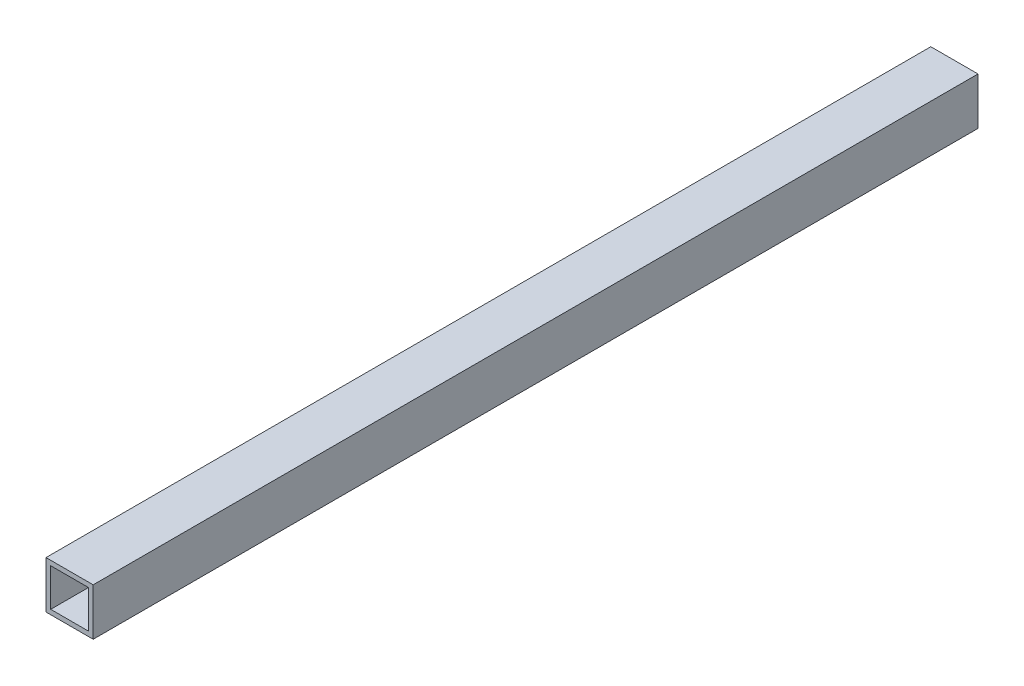
ISO-10303-21;
HEADER;
FILE_DESCRIPTION(('STEP AP214'),'2;1');
FILE_NAME('part.step','',(''),(''),'','','');
FILE_SCHEMA(('AUTOMOTIVE_DESIGN { 1 0 10303 214 1 1 1 1 }'));
ENDSEC;
DATA;
#1=APPLICATION_CONTEXT('core data for automotive mechanical design processes');
#2=APPLICATION_PROTOCOL_DEFINITION('international standard','automotive_design',2000,#1);
#3=PRODUCT_CONTEXT('',#1,'mechanical');
#4=PRODUCT('Part','Part','',(#3));
#5=PRODUCT_RELATED_PRODUCT_CATEGORY('part','',(#4));
#6=PRODUCT_DEFINITION_FORMATION('','',#4);
#7=PRODUCT_DEFINITION_CONTEXT('part definition',#1,'design');
#8=PRODUCT_DEFINITION('design','',#6,#7);
#9=PRODUCT_DEFINITION_SHAPE('','',#8);
#10=(LENGTH_UNIT() NAMED_UNIT(*) SI_UNIT(.MILLI.,.METRE.));
#11=(NAMED_UNIT(*) PLANE_ANGLE_UNIT() SI_UNIT($,.RADIAN.));
#12=(NAMED_UNIT(*) SI_UNIT($,.STERADIAN.) SOLID_ANGLE_UNIT());
#13=UNCERTAINTY_MEASURE_WITH_UNIT(LENGTH_MEASURE(1.E-05),#10,'distance_accuracy_value','');
#14=(GEOMETRIC_REPRESENTATION_CONTEXT(3) GLOBAL_UNCERTAINTY_ASSIGNED_CONTEXT((#13)) GLOBAL_UNIT_ASSIGNED_CONTEXT((#10,
#11,#12)) REPRESENTATION_CONTEXT('',''));
#15=CARTESIAN_POINT('',(0.,0.,0.));
#16=DIRECTION('',(0.,0.,1.));
#17=DIRECTION('',(1.,0.,0.));
#18=AXIS2_PLACEMENT_3D('',#15,#16,#17);
#19=CARTESIAN_POINT('',(0.,0.,750.));
#20=DIRECTION('',(0.,0.,1.));
#21=DIRECTION('',(1.,0.,0.));
#22=AXIS2_PLACEMENT_3D('',#19,#20,#21);
#23=PLANE('',#22);
#24=DIRECTION('',(0.,-1.,0.));
#25=VECTOR('',#24,1.);
#26=CARTESIAN_POINT('',(0.,0.,750.));
#27=LINE('',#26,#25);
#28=CARTESIAN_POINT('',(0.,40.,750.));
#29=VERTEX_POINT('',#28);
#30=CARTESIAN_POINT('',(0.,0.,750.));
#31=VERTEX_POINT('',#30);
#32=EDGE_CURVE('E159',#29,#31,#27,.T.);
#33=ORIENTED_EDGE('',*,*,#32,.T.);
#34=DIRECTION('',(1.,0.,0.));
#35=VECTOR('',#34,1.);
#36=CARTESIAN_POINT('',(0.,0.,750.));
#37=LINE('',#36,#35);
#38=CARTESIAN_POINT('',(40.,0.,750.));
#39=VERTEX_POINT('',#38);
#40=EDGE_CURVE('E162',#31,#39,#37,.T.);
#41=ORIENTED_EDGE('',*,*,#40,.T.);
#42=DIRECTION('',(0.,1.,0.));
#43=VECTOR('',#42,1.);
#44=CARTESIAN_POINT('',(40.,0.,750.));
#45=LINE('',#44,#43);
#46=CARTESIAN_POINT('',(40.,40.,750.));
#47=VERTEX_POINT('',#46);
#48=EDGE_CURVE('E165',#39,#47,#45,.T.);
#49=ORIENTED_EDGE('',*,*,#48,.T.);
#50=DIRECTION('',(-1.,0.,0.));
#51=VECTOR('',#50,1.);
#52=CARTESIAN_POINT('',(0.,40.,750.));
#53=LINE('',#52,#51);
#54=EDGE_CURVE('E167',#47,#29,#53,.T.);
#55=ORIENTED_EDGE('',*,*,#54,.T.);
#56=EDGE_LOOP('',(#33,#41,#49,#55));
#57=FACE_BOUND('',#56,.T.);
#58=DIRECTION('',(1.,0.,0.));
#59=VECTOR('',#58,1.);
#60=CARTESIAN_POINT('',(0.,4.,750.));
#61=LINE('',#60,#59);
#62=CARTESIAN_POINT('',(4.,4.,750.));
#63=VERTEX_POINT('',#62);
#64=CARTESIAN_POINT('',(36.,4.,750.));
#65=VERTEX_POINT('',#64);
#66=EDGE_CURVE('E131',#63,#65,#61,.T.);
#67=ORIENTED_EDGE('',*,*,#66,.F.);
#68=DIRECTION('',(0.,-1.,0.));
#69=VECTOR('',#68,1.);
#70=CARTESIAN_POINT('',(4.,40.,750.));
#71=LINE('',#70,#69);
#72=CARTESIAN_POINT('',(4.,36.,750.));
#73=VERTEX_POINT('',#72);
#74=EDGE_CURVE('E123',#73,#63,#71,.T.);
#75=ORIENTED_EDGE('',*,*,#74,.F.);
#76=DIRECTION('',(-1.,0.,0.));
#77=VECTOR('',#76,1.);
#78=CARTESIAN_POINT('',(0.,36.,750.));
#79=LINE('',#78,#77);
#80=CARTESIAN_POINT('',(36.,36.,750.));
#81=VERTEX_POINT('',#80);
#82=EDGE_CURVE('E145',#81,#73,#79,.T.);
#83=ORIENTED_EDGE('',*,*,#82,.F.);
#84=DIRECTION('',(0.,1.,0.));
#85=VECTOR('',#84,1.);
#86=CARTESIAN_POINT('',(36.,40.,750.));
#87=LINE('',#86,#85);
#88=EDGE_CURVE('E143',#65,#81,#87,.T.);
#89=ORIENTED_EDGE('',*,*,#88,.F.);
#90=EDGE_LOOP('',(#67,#75,#83,#89));
#91=FACE_BOUND('',#90,.T.);
#92=ADVANCED_FACE('F58',(#57,#91),#23,.T.);
#93=CARTESIAN_POINT('',(0.,0.,0.));
#94=DIRECTION('',(0.,0.,1.));
#95=DIRECTION('',(1.,0.,0.));
#96=AXIS2_PLACEMENT_3D('',#93,#94,#95);
#97=PLANE('',#96);
#98=DIRECTION('',(0.,-1.,0.));
#99=VECTOR('',#98,1.);
#100=CARTESIAN_POINT('',(0.,0.,0.));
#101=LINE('',#100,#99);
#102=CARTESIAN_POINT('',(0.,40.,0.));
#103=VERTEX_POINT('',#102);
#104=CARTESIAN_POINT('',(0.,0.,0.));
#105=VERTEX_POINT('',#104);
#106=EDGE_CURVE('E139',#103,#105,#101,.T.);
#107=ORIENTED_EDGE('',*,*,#106,.F.);
#108=DIRECTION('',(-1.,0.,0.));
#109=VECTOR('',#108,1.);
#110=CARTESIAN_POINT('',(0.,40.,0.));
#111=LINE('',#110,#109);
#112=CARTESIAN_POINT('',(40.,40.,0.));
#113=VERTEX_POINT('',#112);
#114=EDGE_CURVE('E163',#113,#103,#111,.T.);
#115=ORIENTED_EDGE('',*,*,#114,.F.);
#116=DIRECTION('',(0.,1.,0.));
#117=VECTOR('',#116,1.);
#118=CARTESIAN_POINT('',(40.,0.,0.));
#119=LINE('',#118,#117);
#120=CARTESIAN_POINT('',(40.,0.,0.));
#121=VERTEX_POINT('',#120);
#122=EDGE_CURVE('E174',#121,#113,#119,.T.);
#123=ORIENTED_EDGE('',*,*,#122,.F.);
#124=DIRECTION('',(1.,0.,0.));
#125=VECTOR('',#124,1.);
#126=CARTESIAN_POINT('',(0.,0.,0.));
#127=LINE('',#126,#125);
#128=EDGE_CURVE('E172',#105,#121,#127,.T.);
#129=ORIENTED_EDGE('',*,*,#128,.F.);
#130=EDGE_LOOP('',(#107,#115,#123,#129));
#131=FACE_BOUND('',#130,.T.);
#132=DIRECTION('',(0.,-1.,0.));
#133=VECTOR('',#132,1.);
#134=CARTESIAN_POINT('',(4.,40.,0.));
#135=LINE('',#134,#133);
#136=CARTESIAN_POINT('',(4.,36.,0.));
#137=VERTEX_POINT('',#136);
#138=CARTESIAN_POINT('',(4.,4.,0.));
#139=VERTEX_POINT('',#138);
#140=EDGE_CURVE('E81',#137,#139,#135,.T.);
#141=ORIENTED_EDGE('',*,*,#140,.T.);
#142=DIRECTION('',(1.,0.,0.));
#143=VECTOR('',#142,1.);
#144=CARTESIAN_POINT('',(0.,4.,0.));
#145=LINE('',#144,#143);
#146=CARTESIAN_POINT('',(36.,4.,0.));
#147=VERTEX_POINT('',#146);
#148=EDGE_CURVE('E138',#139,#147,#145,.T.);
#149=ORIENTED_EDGE('',*,*,#148,.T.);
#150=DIRECTION('',(0.,1.,0.));
#151=VECTOR('',#150,1.);
#152=CARTESIAN_POINT('',(36.,40.,0.));
#153=LINE('',#152,#151);
#154=CARTESIAN_POINT('',(36.,36.,0.));
#155=VERTEX_POINT('',#154);
#156=EDGE_CURVE('E151',#147,#155,#153,.T.);
#157=ORIENTED_EDGE('',*,*,#156,.T.);
#158=DIRECTION('',(-1.,0.,0.));
#159=VECTOR('',#158,1.);
#160=CARTESIAN_POINT('',(0.,36.,0.));
#161=LINE('',#160,#159);
#162=EDGE_CURVE('E132',#155,#137,#161,.T.);
#163=ORIENTED_EDGE('',*,*,#162,.T.);
#164=EDGE_LOOP('',(#141,#149,#157,#163));
#165=FACE_BOUND('',#164,.T.);
#166=ADVANCED_FACE('F192',(#131,#165),#97,.F.);
#167=CARTESIAN_POINT('',(0.,0.,750.));
#168=DIRECTION('',(1.,0.,0.));
#169=DIRECTION('',(0.,0.,-1.));
#170=AXIS2_PLACEMENT_3D('',#167,#168,#169);
#171=PLANE('',#170);
#172=ORIENTED_EDGE('',*,*,#106,.T.);
#173=DIRECTION('',(0.,0.,-1.));
#174=VECTOR('',#173,1.);
#175=CARTESIAN_POINT('',(0.,0.,750.));
#176=LINE('',#175,#174);
#177=EDGE_CURVE('E12',#31,#105,#176,.T.);
#178=ORIENTED_EDGE('',*,*,#177,.F.);
#179=ORIENTED_EDGE('',*,*,#32,.F.);
#180=DIRECTION('',(0.,0.,-1.));
#181=VECTOR('',#180,1.);
#182=CARTESIAN_POINT('',(0.,40.,750.));
#183=LINE('',#182,#181);
#184=EDGE_CURVE('E169',#29,#103,#183,.T.);
#185=ORIENTED_EDGE('',*,*,#184,.T.);
#186=EDGE_LOOP('',(#172,#178,#179,#185));
#187=FACE_BOUND('',#186,.T.);
#188=ADVANCED_FACE('F60',(#187),#171,.F.);
#189=CARTESIAN_POINT('',(0.,0.,750.));
#190=DIRECTION('',(0.,1.,0.));
#191=DIRECTION('',(0.,0.,1.));
#192=AXIS2_PLACEMENT_3D('',#189,#190,#191);
#193=PLANE('',#192);
#194=ORIENTED_EDGE('',*,*,#128,.T.);
#195=DIRECTION('',(0.,0.,-1.));
#196=VECTOR('',#195,1.);
#197=CARTESIAN_POINT('',(40.,0.,750.));
#198=LINE('',#197,#196);
#199=EDGE_CURVE('E66',#39,#121,#198,.T.);
#200=ORIENTED_EDGE('',*,*,#199,.F.);
#201=ORIENTED_EDGE('',*,*,#40,.F.);
#202=ORIENTED_EDGE('',*,*,#177,.T.);
#203=EDGE_LOOP('',(#194,#200,#201,#202));
#204=FACE_BOUND('',#203,.T.);
#205=ADVANCED_FACE('F202',(#204),#193,.F.);
#206=CARTESIAN_POINT('',(40.,0.,750.));
#207=DIRECTION('',(-1.,0.,0.));
#208=DIRECTION('',(0.,0.,1.));
#209=AXIS2_PLACEMENT_3D('',#206,#207,#208);
#210=PLANE('',#209);
#211=ORIENTED_EDGE('',*,*,#122,.T.);
#212=DIRECTION('',(0.,0.,-1.));
#213=VECTOR('',#212,1.);
#214=CARTESIAN_POINT('',(40.,40.,750.));
#215=LINE('',#214,#213);
#216=EDGE_CURVE('E179',#47,#113,#215,.T.);
#217=ORIENTED_EDGE('',*,*,#216,.F.);
#218=ORIENTED_EDGE('',*,*,#48,.F.);
#219=ORIENTED_EDGE('',*,*,#199,.T.);
#220=EDGE_LOOP('',(#211,#217,#218,#219));
#221=FACE_BOUND('',#220,.T.);
#222=ADVANCED_FACE('F186',(#221),#210,.F.);
#223=CARTESIAN_POINT('',(0.,40.,750.));
#224=DIRECTION('',(0.,-1.,0.));
#225=DIRECTION('',(0.,0.,-1.));
#226=AXIS2_PLACEMENT_3D('',#223,#224,#225);
#227=PLANE('',#226);
#228=ORIENTED_EDGE('',*,*,#114,.T.);
#229=ORIENTED_EDGE('',*,*,#184,.F.);
#230=ORIENTED_EDGE('',*,*,#54,.F.);
#231=ORIENTED_EDGE('',*,*,#216,.T.);
#232=EDGE_LOOP('',(#228,#229,#230,#231));
#233=FACE_BOUND('',#232,.T.);
#234=ADVANCED_FACE('F196',(#233),#227,.F.);
#235=CARTESIAN_POINT('',(4.,40.,750.));
#236=DIRECTION('',(1.,0.,0.));
#237=DIRECTION('',(0.,0.,-1.));
#238=AXIS2_PLACEMENT_3D('',#235,#236,#237);
#239=PLANE('',#238);
#240=ORIENTED_EDGE('',*,*,#140,.F.);
#241=DIRECTION('',(0.,0.,-1.));
#242=VECTOR('',#241,1.);
#243=CARTESIAN_POINT('',(4.,36.,750.));
#244=LINE('',#243,#242);
#245=EDGE_CURVE('E127',#73,#137,#244,.T.);
#246=ORIENTED_EDGE('',*,*,#245,.F.);
#247=ORIENTED_EDGE('',*,*,#74,.T.);
#248=DIRECTION('',(0.,0.,-1.));
#249=VECTOR('',#248,1.);
#250=CARTESIAN_POINT('',(4.,4.,750.));
#251=LINE('',#250,#249);
#252=EDGE_CURVE('E126',#63,#139,#251,.T.);
#253=ORIENTED_EDGE('',*,*,#252,.T.);
#254=EDGE_LOOP('',(#240,#246,#247,#253));
#255=FACE_BOUND('',#254,.T.);
#256=ADVANCED_FACE('F125',(#255),#239,.T.);
#257=CARTESIAN_POINT('',(0.,4.,750.));
#258=DIRECTION('',(0.,1.,0.));
#259=DIRECTION('',(0.,0.,1.));
#260=AXIS2_PLACEMENT_3D('',#257,#258,#259);
#261=PLANE('',#260);
#262=ORIENTED_EDGE('',*,*,#148,.F.);
#263=ORIENTED_EDGE('',*,*,#252,.F.);
#264=ORIENTED_EDGE('',*,*,#66,.T.);
#265=DIRECTION('',(0.,0.,-1.));
#266=VECTOR('',#265,1.);
#267=CARTESIAN_POINT('',(36.,4.,750.));
#268=LINE('',#267,#266);
#269=EDGE_CURVE('E140',#65,#147,#268,.T.);
#270=ORIENTED_EDGE('',*,*,#269,.T.);
#271=EDGE_LOOP('',(#262,#263,#264,#270));
#272=FACE_BOUND('',#271,.T.);
#273=ADVANCED_FACE('F135',(#272),#261,.T.);
#274=CARTESIAN_POINT('',(36.,40.,750.));
#275=DIRECTION('',(-1.,0.,0.));
#276=DIRECTION('',(0.,0.,1.));
#277=AXIS2_PLACEMENT_3D('',#274,#275,#276);
#278=PLANE('',#277);
#279=ORIENTED_EDGE('',*,*,#156,.F.);
#280=ORIENTED_EDGE('',*,*,#269,.F.);
#281=ORIENTED_EDGE('',*,*,#88,.T.);
#282=DIRECTION('',(0.,0.,-1.));
#283=VECTOR('',#282,1.);
#284=CARTESIAN_POINT('',(36.,36.,750.));
#285=LINE('',#284,#283);
#286=EDGE_CURVE('E73',#81,#155,#285,.T.);
#287=ORIENTED_EDGE('',*,*,#286,.T.);
#288=EDGE_LOOP('',(#279,#280,#281,#287));
#289=FACE_BOUND('',#288,.T.);
#290=ADVANCED_FACE('F225',(#289),#278,.T.);
#291=CARTESIAN_POINT('',(0.,36.,750.));
#292=DIRECTION('',(0.,-1.,0.));
#293=DIRECTION('',(0.,0.,-1.));
#294=AXIS2_PLACEMENT_3D('',#291,#292,#293);
#295=PLANE('',#294);
#296=ORIENTED_EDGE('',*,*,#162,.F.);
#297=ORIENTED_EDGE('',*,*,#286,.F.);
#298=ORIENTED_EDGE('',*,*,#82,.T.);
#299=ORIENTED_EDGE('',*,*,#245,.T.);
#300=EDGE_LOOP('',(#296,#297,#298,#299));
#301=FACE_BOUND('',#300,.T.);
#302=ADVANCED_FACE('F229',(#301),#295,.T.);
#303=CLOSED_SHELL('',(#92,#166,#188,#205,#222,#234,#256,#273,#290,#302));
#304=MANIFOLD_SOLID_BREP('B2',#303);
#305=ADVANCED_BREP_SHAPE_REPRESENTATION('',(#18,#304),#14);
#306=SHAPE_DEFINITION_REPRESENTATION(#9,#305);
ENDSEC;
END-ISO-10303-21;
